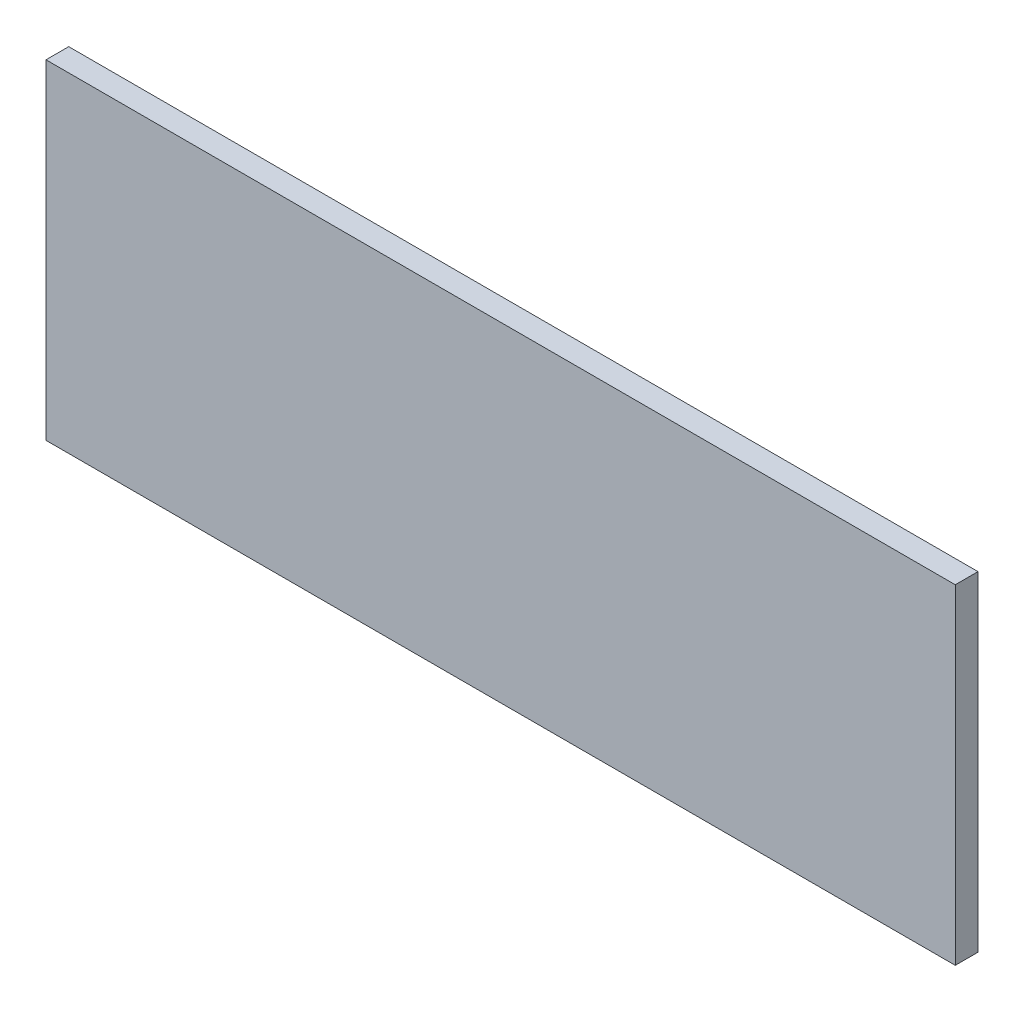
ISO-10303-21;
HEADER;
FILE_DESCRIPTION(('STEP AP214'),'2;1');
FILE_NAME('part.step','',(''),(''),'','','');
FILE_SCHEMA(('AUTOMOTIVE_DESIGN { 1 0 10303 214 1 1 1 1 }'));
ENDSEC;
DATA;
#1=APPLICATION_CONTEXT('core data for automotive mechanical design processes');
#2=APPLICATION_PROTOCOL_DEFINITION('international standard','automotive_design',2000,#1);
#3=PRODUCT_CONTEXT('',#1,'mechanical');
#4=PRODUCT('Part','Part','',(#3));
#5=PRODUCT_RELATED_PRODUCT_CATEGORY('part','',(#4));
#6=PRODUCT_DEFINITION_FORMATION('','',#4);
#7=PRODUCT_DEFINITION_CONTEXT('part definition',#1,'design');
#8=PRODUCT_DEFINITION('design','',#6,#7);
#9=PRODUCT_DEFINITION_SHAPE('','',#8);
#10=(LENGTH_UNIT() NAMED_UNIT(*) SI_UNIT(.MILLI.,.METRE.));
#11=(NAMED_UNIT(*) PLANE_ANGLE_UNIT() SI_UNIT($,.RADIAN.));
#12=(NAMED_UNIT(*) SI_UNIT($,.STERADIAN.) SOLID_ANGLE_UNIT());
#13=UNCERTAINTY_MEASURE_WITH_UNIT(LENGTH_MEASURE(1.E-05),#10,'distance_accuracy_value','');
#14=(GEOMETRIC_REPRESENTATION_CONTEXT(3) GLOBAL_UNCERTAINTY_ASSIGNED_CONTEXT((#13)) GLOBAL_UNIT_ASSIGNED_CONTEXT((#10,
#11,#12)) REPRESENTATION_CONTEXT('',''));
#15=CARTESIAN_POINT('',(0.,0.,0.));
#16=DIRECTION('',(0.,0.,1.));
#17=DIRECTION('',(1.,0.,0.));
#18=AXIS2_PLACEMENT_3D('',#15,#16,#17);
#19=CARTESIAN_POINT('',(0.,0.,2.));
#20=DIRECTION('',(1.,0.,0.));
#21=DIRECTION('',(0.,0.,-1.));
#22=AXIS2_PLACEMENT_3D('',#19,#20,#21);
#23=PLANE('',#22);
#24=DIRECTION('',(0.,-1.,0.));
#25=VECTOR('',#24,1.);
#26=CARTESIAN_POINT('',(0.,0.,0.));
#27=LINE('',#26,#25);
#28=CARTESIAN_POINT('',(0.,29.,0.));
#29=VERTEX_POINT('',#28);
#30=CARTESIAN_POINT('',(0.,0.,0.));
#31=VERTEX_POINT('',#30);
#32=EDGE_CURVE('E96',#29,#31,#27,.T.);
#33=ORIENTED_EDGE('',*,*,#32,.T.);
#34=DIRECTION('',(0.,0.,-1.));
#35=VECTOR('',#34,1.);
#36=CARTESIAN_POINT('',(0.,0.,2.));
#37=LINE('',#36,#35);
#38=CARTESIAN_POINT('',(0.,0.,2.));
#39=VERTEX_POINT('',#38);
#40=EDGE_CURVE('E11',#39,#31,#37,.T.);
#41=ORIENTED_EDGE('',*,*,#40,.F.);
#42=DIRECTION('',(0.,-1.,0.));
#43=VECTOR('',#42,1.);
#44=CARTESIAN_POINT('',(0.,0.,2.));
#45=LINE('',#44,#43);
#46=CARTESIAN_POINT('',(0.,29.,2.));
#47=VERTEX_POINT('',#46);
#48=EDGE_CURVE('E84',#47,#39,#45,.T.);
#49=ORIENTED_EDGE('',*,*,#48,.F.);
#50=DIRECTION('',(0.,0.,-1.));
#51=VECTOR('',#50,1.);
#52=CARTESIAN_POINT('',(0.,29.,2.));
#53=LINE('',#52,#51);
#54=EDGE_CURVE('E92',#47,#29,#53,.T.);
#55=ORIENTED_EDGE('',*,*,#54,.T.);
#56=EDGE_LOOP('',(#33,#41,#49,#55));
#57=FACE_BOUND('',#56,.T.);
#58=ADVANCED_FACE('F33',(#57),#23,.F.);
#59=CARTESIAN_POINT('',(0.,0.,2.));
#60=DIRECTION('',(0.,1.,0.));
#61=DIRECTION('',(0.,0.,1.));
#62=AXIS2_PLACEMENT_3D('',#59,#60,#61);
#63=PLANE('',#62);
#64=DIRECTION('',(1.,0.,0.));
#65=VECTOR('',#64,1.);
#66=CARTESIAN_POINT('',(0.,0.,0.));
#67=LINE('',#66,#65);
#68=CARTESIAN_POINT('',(80.,0.,0.));
#69=VERTEX_POINT('',#68);
#70=EDGE_CURVE('E88',#31,#69,#67,.T.);
#71=ORIENTED_EDGE('',*,*,#70,.T.);
#72=DIRECTION('',(0.,0.,-1.));
#73=VECTOR('',#72,1.);
#74=CARTESIAN_POINT('',(80.,0.,2.));
#75=LINE('',#74,#73);
#76=CARTESIAN_POINT('',(80.,0.,2.));
#77=VERTEX_POINT('',#76);
#78=EDGE_CURVE('E41',#77,#69,#75,.T.);
#79=ORIENTED_EDGE('',*,*,#78,.F.);
#80=DIRECTION('',(1.,0.,0.));
#81=VECTOR('',#80,1.);
#82=CARTESIAN_POINT('',(0.,0.,2.));
#83=LINE('',#82,#81);
#84=EDGE_CURVE('E79',#39,#77,#83,.T.);
#85=ORIENTED_EDGE('',*,*,#84,.F.);
#86=ORIENTED_EDGE('',*,*,#40,.T.);
#87=EDGE_LOOP('',(#71,#79,#85,#86));
#88=FACE_BOUND('',#87,.T.);
#89=ADVANCED_FACE('F87',(#88),#63,.F.);
#90=CARTESIAN_POINT('',(80.,0.,2.));
#91=DIRECTION('',(-1.,0.,0.));
#92=DIRECTION('',(0.,0.,1.));
#93=AXIS2_PLACEMENT_3D('',#90,#91,#92);
#94=PLANE('',#93);
#95=DIRECTION('',(0.,1.,0.));
#96=VECTOR('',#95,1.);
#97=CARTESIAN_POINT('',(80.,0.,0.));
#98=LINE('',#97,#96);
#99=CARTESIAN_POINT('',(80.,29.,0.));
#100=VERTEX_POINT('',#99);
#101=EDGE_CURVE('E66',#69,#100,#98,.T.);
#102=ORIENTED_EDGE('',*,*,#101,.T.);
#103=DIRECTION('',(0.,0.,-1.));
#104=VECTOR('',#103,1.);
#105=CARTESIAN_POINT('',(80.,29.,2.));
#106=LINE('',#105,#104);
#107=CARTESIAN_POINT('',(80.,29.,2.));
#108=VERTEX_POINT('',#107);
#109=EDGE_CURVE('E89',#108,#100,#106,.T.);
#110=ORIENTED_EDGE('',*,*,#109,.F.);
#111=DIRECTION('',(0.,1.,0.));
#112=VECTOR('',#111,1.);
#113=CARTESIAN_POINT('',(80.,0.,2.));
#114=LINE('',#113,#112);
#115=EDGE_CURVE('E82',#77,#108,#114,.T.);
#116=ORIENTED_EDGE('',*,*,#115,.F.);
#117=ORIENTED_EDGE('',*,*,#78,.T.);
#118=EDGE_LOOP('',(#102,#110,#116,#117));
#119=FACE_BOUND('',#118,.T.);
#120=ADVANCED_FACE('F90',(#119),#94,.F.);
#121=CARTESIAN_POINT('',(0.,29.,2.));
#122=DIRECTION('',(0.,-1.,0.));
#123=DIRECTION('',(0.,0.,-1.));
#124=AXIS2_PLACEMENT_3D('',#121,#122,#123);
#125=PLANE('',#124);
#126=DIRECTION('',(-1.,0.,0.));
#127=VECTOR('',#126,1.);
#128=CARTESIAN_POINT('',(0.,29.,0.));
#129=LINE('',#128,#127);
#130=EDGE_CURVE('E72',#100,#29,#129,.T.);
#131=ORIENTED_EDGE('',*,*,#130,.T.);
#132=ORIENTED_EDGE('',*,*,#54,.F.);
#133=DIRECTION('',(-1.,0.,0.));
#134=VECTOR('',#133,1.);
#135=CARTESIAN_POINT('',(0.,29.,2.));
#136=LINE('',#135,#134);
#137=EDGE_CURVE('E49',#108,#47,#136,.T.);
#138=ORIENTED_EDGE('',*,*,#137,.F.);
#139=ORIENTED_EDGE('',*,*,#109,.T.);
#140=EDGE_LOOP('',(#131,#132,#138,#139));
#141=FACE_BOUND('',#140,.T.);
#142=ADVANCED_FACE('F103',(#141),#125,.F.);
#143=CARTESIAN_POINT('',(0.,0.,2.));
#144=DIRECTION('',(0.,0.,-1.));
#145=DIRECTION('',(-1.,0.,0.));
#146=AXIS2_PLACEMENT_3D('',#143,#144,#145);
#147=PLANE('',#146);
#148=ORIENTED_EDGE('',*,*,#48,.T.);
#149=ORIENTED_EDGE('',*,*,#84,.T.);
#150=ORIENTED_EDGE('',*,*,#115,.T.);
#151=ORIENTED_EDGE('',*,*,#137,.T.);
#152=EDGE_LOOP('',(#148,#149,#150,#151));
#153=FACE_BOUND('',#152,.T.);
#154=ADVANCED_FACE('F80',(#153),#147,.F.);
#155=CARTESIAN_POINT('',(0.,0.,0.));
#156=DIRECTION('',(0.,0.,-1.));
#157=DIRECTION('',(-1.,0.,0.));
#158=AXIS2_PLACEMENT_3D('',#155,#156,#157);
#159=PLANE('',#158);
#160=ORIENTED_EDGE('',*,*,#32,.F.);
#161=ORIENTED_EDGE('',*,*,#130,.F.);
#162=ORIENTED_EDGE('',*,*,#101,.F.);
#163=ORIENTED_EDGE('',*,*,#70,.F.);
#164=EDGE_LOOP('',(#160,#161,#162,#163));
#165=FACE_BOUND('',#164,.T.);
#166=ADVANCED_FACE('F106',(#165),#159,.T.);
#167=CLOSED_SHELL('',(#58,#89,#120,#142,#154,#166));
#168=MANIFOLD_SOLID_BREP('B2',#167);
#169=ADVANCED_BREP_SHAPE_REPRESENTATION('',(#18,#168),#14);
#170=SHAPE_DEFINITION_REPRESENTATION(#9,#169);
ENDSEC;
END-ISO-10303-21;
